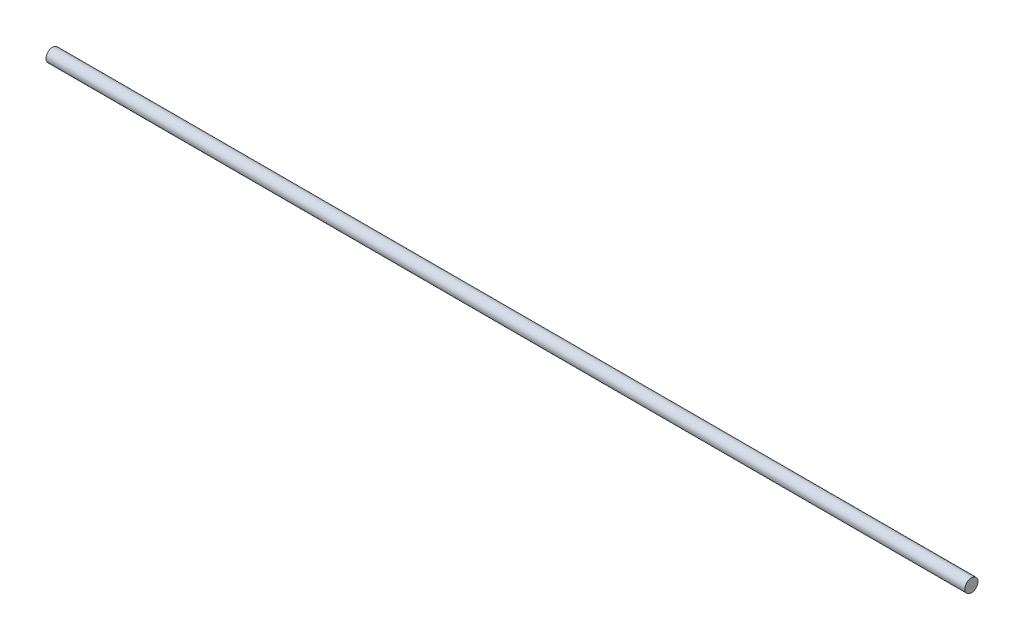
ISO-10303-21;
HEADER;
FILE_DESCRIPTION(('STEP AP214'),'2;1');
FILE_NAME('part.step','',(''),(''),'','','');
FILE_SCHEMA(('AUTOMOTIVE_DESIGN { 1 0 10303 214 1 1 1 1 }'));
ENDSEC;
DATA;
#1=APPLICATION_CONTEXT('core data for automotive mechanical design processes');
#2=APPLICATION_PROTOCOL_DEFINITION('international standard','automotive_design',2000,#1);
#3=PRODUCT_CONTEXT('',#1,'mechanical');
#4=PRODUCT('Part','Part','',(#3));
#5=PRODUCT_RELATED_PRODUCT_CATEGORY('part','',(#4));
#6=PRODUCT_DEFINITION_FORMATION('','',#4);
#7=PRODUCT_DEFINITION_CONTEXT('part definition',#1,'design');
#8=PRODUCT_DEFINITION('design','',#6,#7);
#9=PRODUCT_DEFINITION_SHAPE('','',#8);
#10=(LENGTH_UNIT() NAMED_UNIT(*) SI_UNIT(.MILLI.,.METRE.));
#11=(NAMED_UNIT(*) PLANE_ANGLE_UNIT() SI_UNIT($,.RADIAN.));
#12=(NAMED_UNIT(*) SI_UNIT($,.STERADIAN.) SOLID_ANGLE_UNIT());
#13=UNCERTAINTY_MEASURE_WITH_UNIT(LENGTH_MEASURE(1.E-05),#10,'distance_accuracy_value','');
#14=(GEOMETRIC_REPRESENTATION_CONTEXT(3) GLOBAL_UNCERTAINTY_ASSIGNED_CONTEXT((#13)) GLOBAL_UNIT_ASSIGNED_CONTEXT((#10,
#11,#12)) REPRESENTATION_CONTEXT('',''));
#15=CARTESIAN_POINT('',(0.,0.,0.));
#16=DIRECTION('',(0.,0.,1.));
#17=DIRECTION('',(1.,0.,0.));
#18=AXIS2_PLACEMENT_3D('',#15,#16,#17);
#19=CARTESIAN_POINT('',(-350.,0.,0.));
#20=DIRECTION('',(1.,0.,0.));
#21=DIRECTION('',(0.,0.,-1.));
#22=AXIS2_PLACEMENT_3D('',#19,#20,#21);
#23=CYLINDRICAL_SURFACE('',#22,2.5);
#24=CARTESIAN_POINT('',(-350.,0.,0.));
#25=DIRECTION('',(1.,0.,0.));
#26=DIRECTION('',(0.,0.,-1.));
#27=AXIS2_PLACEMENT_3D('',#24,#25,#26);
#28=CIRCLE('',#27,2.5);
#29=CARTESIAN_POINT('',(-350.,0.,-2.5));
#30=VERTEX_POINT('',#29);
#31=EDGE_CURVE('E10',#30,#30,#28,.T.);
#32=ORIENTED_EDGE('',*,*,#31,.T.);
#33=EDGE_LOOP('',(#32));
#34=FACE_BOUND('',#33,.T.);
#35=CARTESIAN_POINT('',(0.,0.,0.));
#36=DIRECTION('',(1.,0.,0.));
#37=DIRECTION('',(0.,0.,-1.));
#38=AXIS2_PLACEMENT_3D('',#35,#36,#37);
#39=CIRCLE('',#38,2.5);
#40=CARTESIAN_POINT('',(0.,0.,-2.5));
#41=VERTEX_POINT('',#40);
#42=EDGE_CURVE('E35',#41,#41,#39,.T.);
#43=ORIENTED_EDGE('',*,*,#42,.F.);
#44=EDGE_LOOP('',(#43));
#45=FACE_BOUND('',#44,.T.);
#46=ADVANCED_FACE('F32',(#34,#45),#23,.T.);
#47=CARTESIAN_POINT('',(-350.,0.,0.));
#48=DIRECTION('',(1.,0.,0.));
#49=DIRECTION('',(0.,0.,-1.));
#50=AXIS2_PLACEMENT_3D('',#47,#48,#49);
#51=PLANE('',#50);
#52=ORIENTED_EDGE('',*,*,#31,.F.);
#53=EDGE_LOOP('',(#52));
#54=FACE_BOUND('',#53,.T.);
#55=ADVANCED_FACE('F47',(#54),#51,.F.);
#56=CARTESIAN_POINT('',(0.,0.,0.));
#57=DIRECTION('',(1.,0.,0.));
#58=DIRECTION('',(0.,0.,-1.));
#59=AXIS2_PLACEMENT_3D('',#56,#57,#58);
#60=PLANE('',#59);
#61=ORIENTED_EDGE('',*,*,#42,.T.);
#62=EDGE_LOOP('',(#61));
#63=FACE_BOUND('',#62,.T.);
#64=ADVANCED_FACE('F44',(#63),#60,.T.);
#65=CLOSED_SHELL('',(#46,#55,#64));
#66=MANIFOLD_SOLID_BREP('B2',#65);
#67=ADVANCED_BREP_SHAPE_REPRESENTATION('',(#18,#66),#14);
#68=SHAPE_DEFINITION_REPRESENTATION(#9,#67);
ENDSEC;
END-ISO-10303-21;
